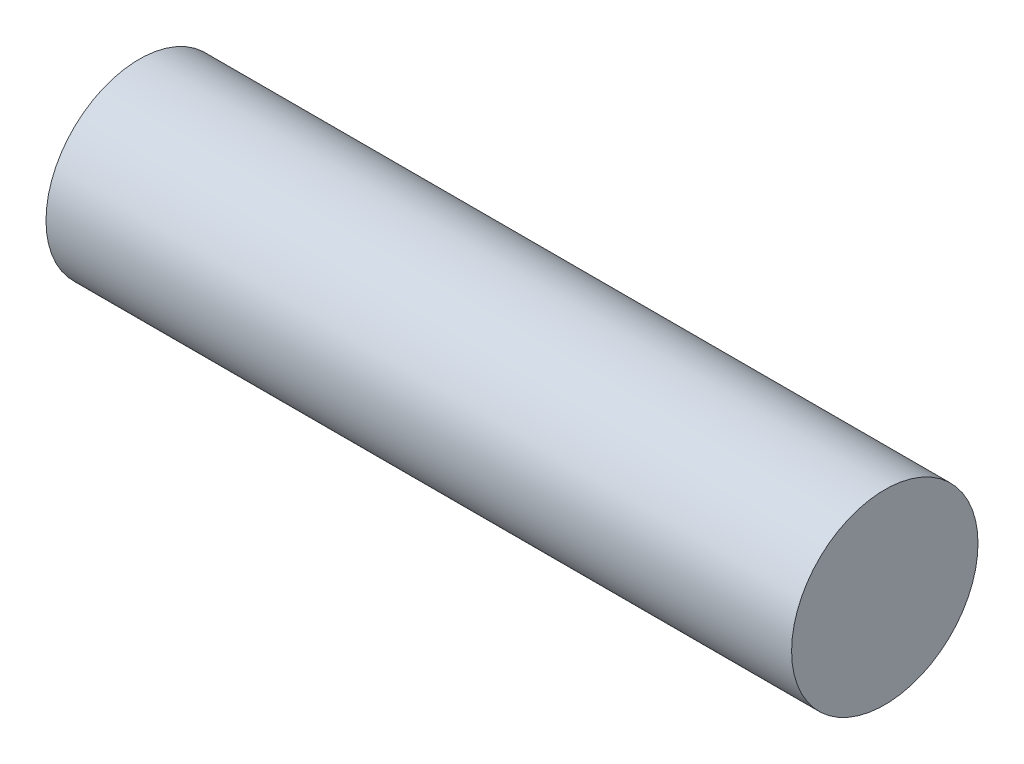
ISO-10303-21;
HEADER;
FILE_DESCRIPTION(('STEP AP214'),'2;1');
FILE_NAME('part.step','',(''),(''),'','','');
FILE_SCHEMA(('AUTOMOTIVE_DESIGN { 1 0 10303 214 1 1 1 1 }'));
ENDSEC;
DATA;
#1=APPLICATION_CONTEXT('core data for automotive mechanical design processes');
#2=APPLICATION_PROTOCOL_DEFINITION('international standard','automotive_design',2000,#1);
#3=PRODUCT_CONTEXT('',#1,'mechanical');
#4=PRODUCT('Part','Part','',(#3));
#5=PRODUCT_RELATED_PRODUCT_CATEGORY('part','',(#4));
#6=PRODUCT_DEFINITION_FORMATION('','',#4);
#7=PRODUCT_DEFINITION_CONTEXT('part definition',#1,'design');
#8=PRODUCT_DEFINITION('design','',#6,#7);
#9=PRODUCT_DEFINITION_SHAPE('','',#8);
#10=(LENGTH_UNIT() NAMED_UNIT(*) SI_UNIT(.MILLI.,.METRE.));
#11=(NAMED_UNIT(*) PLANE_ANGLE_UNIT() SI_UNIT($,.RADIAN.));
#12=(NAMED_UNIT(*) SI_UNIT($,.STERADIAN.) SOLID_ANGLE_UNIT());
#13=UNCERTAINTY_MEASURE_WITH_UNIT(LENGTH_MEASURE(1.E-05),#10,'distance_accuracy_value','');
#14=(GEOMETRIC_REPRESENTATION_CONTEXT(3) GLOBAL_UNCERTAINTY_ASSIGNED_CONTEXT((#13)) GLOBAL_UNIT_ASSIGNED_CONTEXT((#10,
#11,#12)) REPRESENTATION_CONTEXT('',''));
#15=CARTESIAN_POINT('',(0.,0.,0.));
#16=DIRECTION('',(0.,0.,1.));
#17=DIRECTION('',(1.,0.,0.));
#18=AXIS2_PLACEMENT_3D('',#15,#16,#17);
#19=CARTESIAN_POINT('',(0.,0.,0.));
#20=DIRECTION('',(1.,0.,0.));
#21=DIRECTION('',(0.,0.,-1.));
#22=AXIS2_PLACEMENT_3D('',#19,#20,#21);
#23=CYLINDRICAL_SURFACE('',#22,3.75);
#24=CARTESIAN_POINT('',(20.,0.,0.));
#25=DIRECTION('',(1.,0.,0.));
#26=DIRECTION('',(0.,0.,-1.));
#27=AXIS2_PLACEMENT_3D('',#24,#25,#26);
#28=CIRCLE('',#27,3.75);
#29=CARTESIAN_POINT('',(20.,0.,-3.75));
#30=VERTEX_POINT('',#29);
#31=EDGE_CURVE('E10',#30,#30,#28,.T.);
#32=ORIENTED_EDGE('',*,*,#31,.F.);
#33=EDGE_LOOP('',(#32));
#34=FACE_BOUND('',#33,.T.);
#35=CARTESIAN_POINT('',(-10.,0.,0.));
#36=DIRECTION('',(-1.,0.,0.));
#37=DIRECTION('',(0.,0.,1.));
#38=AXIS2_PLACEMENT_3D('',#35,#36,#37);
#39=CIRCLE('',#38,3.75);
#40=CARTESIAN_POINT('',(-10.,0.,3.75));
#41=VERTEX_POINT('',#40);
#42=EDGE_CURVE('E43',#41,#41,#39,.T.);
#43=ORIENTED_EDGE('',*,*,#42,.F.);
#44=EDGE_LOOP('',(#43));
#45=FACE_BOUND('',#44,.T.);
#46=ADVANCED_FACE('F37',(#34,#45),#23,.T.);
#47=CARTESIAN_POINT('',(20.,0.,0.));
#48=DIRECTION('',(1.,0.,0.));
#49=DIRECTION('',(0.,0.,-1.));
#50=AXIS2_PLACEMENT_3D('',#47,#48,#49);
#51=PLANE('',#50);
#52=ORIENTED_EDGE('',*,*,#31,.T.);
#53=EDGE_LOOP('',(#52));
#54=FACE_BOUND('',#53,.T.);
#55=ADVANCED_FACE('F52',(#54),#51,.T.);
#56=CARTESIAN_POINT('',(-10.,0.,0.));
#57=DIRECTION('',(-1.,0.,0.));
#58=DIRECTION('',(0.,0.,1.));
#59=AXIS2_PLACEMENT_3D('',#56,#57,#58);
#60=PLANE('',#59);
#61=ORIENTED_EDGE('',*,*,#42,.T.);
#62=EDGE_LOOP('',(#61));
#63=FACE_BOUND('',#62,.T.);
#64=ADVANCED_FACE('F49',(#63),#60,.T.);
#65=CLOSED_SHELL('',(#46,#55,#64));
#66=MANIFOLD_SOLID_BREP('B2',#65);
#67=ADVANCED_BREP_SHAPE_REPRESENTATION('',(#18,#66),#14);
#68=SHAPE_DEFINITION_REPRESENTATION(#9,#67);
ENDSEC;
END-ISO-10303-21;
